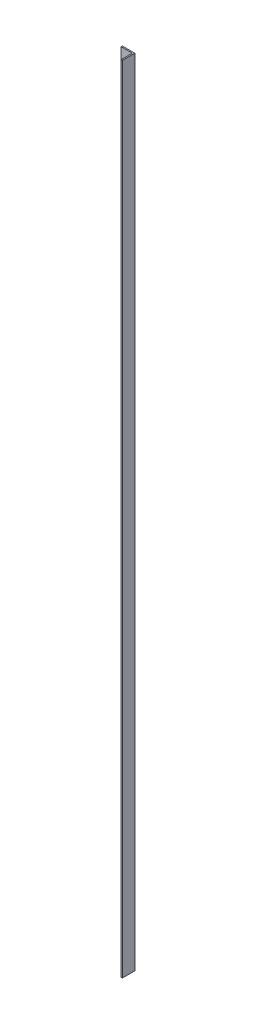
ISO-10303-21;
HEADER;
FILE_DESCRIPTION(('STEP AP214'),'2;1');
FILE_NAME('part.step','',(''),(''),'','','');
FILE_SCHEMA(('AUTOMOTIVE_DESIGN { 1 0 10303 214 1 1 1 1 }'));
ENDSEC;
DATA;
#1=APPLICATION_CONTEXT('core data for automotive mechanical design processes');
#2=APPLICATION_PROTOCOL_DEFINITION('international standard','automotive_design',2000,#1);
#3=PRODUCT_CONTEXT('',#1,'mechanical');
#4=PRODUCT('Part','Part','',(#3));
#5=PRODUCT_RELATED_PRODUCT_CATEGORY('part','',(#4));
#6=PRODUCT_DEFINITION_FORMATION('','',#4);
#7=PRODUCT_DEFINITION_CONTEXT('part definition',#1,'design');
#8=PRODUCT_DEFINITION('design','',#6,#7);
#9=PRODUCT_DEFINITION_SHAPE('','',#8);
#10=(LENGTH_UNIT() NAMED_UNIT(*) SI_UNIT(.MILLI.,.METRE.));
#11=(NAMED_UNIT(*) PLANE_ANGLE_UNIT() SI_UNIT($,.RADIAN.));
#12=(NAMED_UNIT(*) SI_UNIT($,.STERADIAN.) SOLID_ANGLE_UNIT());
#13=UNCERTAINTY_MEASURE_WITH_UNIT(LENGTH_MEASURE(1.E-05),#10,'distance_accuracy_value','');
#14=(GEOMETRIC_REPRESENTATION_CONTEXT(3) GLOBAL_UNCERTAINTY_ASSIGNED_CONTEXT((#13)) GLOBAL_UNIT_ASSIGNED_CONTEXT((#10,
#11,#12)) REPRESENTATION_CONTEXT('',''));
#15=CARTESIAN_POINT('',(0.,0.,0.));
#16=DIRECTION('',(0.,0.,1.));
#17=DIRECTION('',(1.,0.,0.));
#18=AXIS2_PLACEMENT_3D('',#15,#16,#17);
#19=CARTESIAN_POINT('',(-492.499999999999,2893.75,5.));
#20=DIRECTION('',(1.,0.,0.));
#21=DIRECTION('',(0.,1.,0.));
#22=AXIS2_PLACEMENT_3D('',#19,#20,#21);
#23=PLANE('',#22);
#24=DIRECTION('',(0.,-1.,0.));
#25=VECTOR('',#24,1.);
#26=CARTESIAN_POINT('',(-492.499999999999,2893.75,0.));
#27=LINE('',#26,#25);
#28=CARTESIAN_POINT('',(-492.499999999999,2893.75,0.));
#29=VERTEX_POINT('',#28);
#30=CARTESIAN_POINT('',(-492.499999999999,-306.249999999999,0.));
#31=VERTEX_POINT('',#30);
#32=EDGE_CURVE('E94',#29,#31,#27,.T.);
#33=ORIENTED_EDGE('',*,*,#32,.T.);
#34=DIRECTION('',(0.,0.,-1.));
#35=VECTOR('',#34,1.);
#36=CARTESIAN_POINT('',(-492.499999999999,-306.249999999999,5.));
#37=LINE('',#36,#35);
#38=CARTESIAN_POINT('',(-492.499999999999,-306.249999999999,5.));
#39=VERTEX_POINT('',#38);
#40=EDGE_CURVE('E11',#39,#31,#37,.T.);
#41=ORIENTED_EDGE('',*,*,#40,.F.);
#42=DIRECTION('',(0.,-1.,0.));
#43=VECTOR('',#42,1.);
#44=CARTESIAN_POINT('',(-492.499999999999,2893.75,5.));
#45=LINE('',#44,#43);
#46=CARTESIAN_POINT('',(-492.499999999999,2893.75,5.));
#47=VERTEX_POINT('',#46);
#48=EDGE_CURVE('E86',#47,#39,#45,.T.);
#49=ORIENTED_EDGE('',*,*,#48,.F.);
#50=DIRECTION('',(0.,0.,-1.));
#51=VECTOR('',#50,1.);
#52=CARTESIAN_POINT('',(-492.499999999999,2893.75,5.));
#53=LINE('',#52,#51);
#54=EDGE_CURVE('E42',#47,#29,#53,.T.);
#55=ORIENTED_EDGE('',*,*,#54,.T.);
#56=EDGE_LOOP('',(#33,#41,#49,#55));
#57=FACE_BOUND('',#56,.T.);
#58=ADVANCED_FACE('F34',(#57),#23,.F.);
#59=CARTESIAN_POINT('',(-492.499999999999,-306.249999999999,5.));
#60=DIRECTION('',(0.,1.,0.));
#61=DIRECTION('',(0.,0.,1.));
#62=AXIS2_PLACEMENT_3D('',#59,#60,#61);
#63=PLANE('',#62);
#64=DIRECTION('',(1.,0.,0.));
#65=VECTOR('',#64,1.);
#66=CARTESIAN_POINT('',(-492.499999999999,-306.249999999999,0.));
#67=LINE('',#66,#65);
#68=CARTESIAN_POINT('',(-442.499999999999,-306.249999999999,0.));
#69=VERTEX_POINT('',#68);
#70=EDGE_CURVE('E63',#31,#69,#67,.T.);
#71=ORIENTED_EDGE('',*,*,#70,.T.);
#72=DIRECTION('',(0.,0.,-1.));
#73=VECTOR('',#72,1.);
#74=CARTESIAN_POINT('',(-442.499999999999,-306.249999999999,5.));
#75=LINE('',#74,#73);
#76=CARTESIAN_POINT('',(-442.499999999999,-306.249999999999,50.));
#77=VERTEX_POINT('',#76);
#78=EDGE_CURVE('E109',#77,#69,#75,.T.);
#79=ORIENTED_EDGE('',*,*,#78,.F.);
#80=DIRECTION('',(1.,0.,0.));
#81=VECTOR('',#80,1.);
#82=CARTESIAN_POINT('',(-442.499999999999,-306.249999999999,50.));
#83=LINE('',#82,#81);
#84=CARTESIAN_POINT('',(-447.499999999999,-306.249999999999,50.));
#85=VERTEX_POINT('',#84);
#86=EDGE_CURVE('E123',#85,#77,#83,.T.);
#87=ORIENTED_EDGE('',*,*,#86,.F.);
#88=DIRECTION('',(0.,0.,1.));
#89=VECTOR('',#88,1.);
#90=CARTESIAN_POINT('',(-447.499999999999,-306.249999999999,50.));
#91=LINE('',#90,#89);
#92=CARTESIAN_POINT('',(-447.499999999999,-306.249999999999,5.00000000000001));
#93=VERTEX_POINT('',#92);
#94=EDGE_CURVE('E85',#93,#85,#91,.T.);
#95=ORIENTED_EDGE('',*,*,#94,.F.);
#96=DIRECTION('',(1.,0.,0.));
#97=VECTOR('',#96,1.);
#98=CARTESIAN_POINT('',(-492.499999999999,-306.249999999999,5.));
#99=LINE('',#98,#97);
#100=EDGE_CURVE('E80',#39,#93,#99,.T.);
#101=ORIENTED_EDGE('',*,*,#100,.F.);
#102=ORIENTED_EDGE('',*,*,#40,.T.);
#103=EDGE_LOOP('',(#71,#79,#87,#95,#101,#102));
#104=FACE_BOUND('',#103,.T.);
#105=ADVANCED_FACE('F81',(#104),#63,.F.);
#106=CARTESIAN_POINT('',(-492.499999999999,2893.75,5.));
#107=DIRECTION('',(0.,-1.,0.));
#108=DIRECTION('',(0.,0.,-1.));
#109=AXIS2_PLACEMENT_3D('',#106,#107,#108);
#110=PLANE('',#109);
#111=DIRECTION('',(-1.,0.,0.));
#112=VECTOR('',#111,1.);
#113=CARTESIAN_POINT('',(-492.499999999999,2893.75,0.));
#114=LINE('',#113,#112);
#115=CARTESIAN_POINT('',(-442.499999999999,2893.75,0.));
#116=VERTEX_POINT('',#115);
#117=EDGE_CURVE('E92',#116,#29,#114,.T.);
#118=ORIENTED_EDGE('',*,*,#117,.T.);
#119=ORIENTED_EDGE('',*,*,#54,.F.);
#120=DIRECTION('',(-1.,0.,0.));
#121=VECTOR('',#120,1.);
#122=CARTESIAN_POINT('',(-492.499999999999,2893.75,5.));
#123=LINE('',#122,#121);
#124=CARTESIAN_POINT('',(-447.499999999999,2893.75,5.));
#125=VERTEX_POINT('',#124);
#126=EDGE_CURVE('E50',#125,#47,#123,.T.);
#127=ORIENTED_EDGE('',*,*,#126,.F.);
#128=DIRECTION('',(0.,0.,1.));
#129=VECTOR('',#128,1.);
#130=CARTESIAN_POINT('',(-447.499999999999,2893.75,50.));
#131=LINE('',#130,#129);
#132=CARTESIAN_POINT('',(-447.499999999999,2893.75,50.));
#133=VERTEX_POINT('',#132);
#134=EDGE_CURVE('E118',#125,#133,#131,.T.);
#135=ORIENTED_EDGE('',*,*,#134,.T.);
#136=DIRECTION('',(1.,0.,0.));
#137=VECTOR('',#136,1.);
#138=CARTESIAN_POINT('',(-442.499999999999,2893.75,50.));
#139=LINE('',#138,#137);
#140=CARTESIAN_POINT('',(-442.499999999999,2893.75,50.));
#141=VERTEX_POINT('',#140);
#142=EDGE_CURVE('E115',#133,#141,#139,.T.);
#143=ORIENTED_EDGE('',*,*,#142,.T.);
#144=DIRECTION('',(0.,0.,-1.));
#145=VECTOR('',#144,1.);
#146=CARTESIAN_POINT('',(-442.499999999999,2893.75,0.));
#147=LINE('',#146,#145);
#148=EDGE_CURVE('E112',#141,#116,#147,.T.);
#149=ORIENTED_EDGE('',*,*,#148,.T.);
#150=EDGE_LOOP('',(#118,#119,#127,#135,#143,#149));
#151=FACE_BOUND('',#150,.T.);
#152=ADVANCED_FACE('F143',(#151),#110,.F.);
#153=CARTESIAN_POINT('',(0.,0.,5.));
#154=DIRECTION('',(0.,0.,1.));
#155=DIRECTION('',(1.,0.,0.));
#156=AXIS2_PLACEMENT_3D('',#153,#154,#155);
#157=PLANE('',#156);
#158=ORIENTED_EDGE('',*,*,#48,.T.);
#159=ORIENTED_EDGE('',*,*,#100,.T.);
#160=DIRECTION('',(0.,1.,0.));
#161=VECTOR('',#160,1.);
#162=CARTESIAN_POINT('',(-447.499999999999,2893.75,5.));
#163=LINE('',#162,#161);
#164=EDGE_CURVE('E70',#93,#125,#163,.T.);
#165=ORIENTED_EDGE('',*,*,#164,.T.);
#166=ORIENTED_EDGE('',*,*,#126,.T.);
#167=EDGE_LOOP('',(#158,#159,#165,#166));
#168=FACE_BOUND('',#167,.T.);
#169=ADVANCED_FACE('F89',(#168),#157,.T.);
#170=CARTESIAN_POINT('',(0.,0.,0.));
#171=DIRECTION('',(0.,0.,1.));
#172=DIRECTION('',(1.,0.,0.));
#173=AXIS2_PLACEMENT_3D('',#170,#171,#172);
#174=PLANE('',#173);
#175=ORIENTED_EDGE('',*,*,#32,.F.);
#176=ORIENTED_EDGE('',*,*,#117,.F.);
#177=DIRECTION('',(0.,1.,0.));
#178=VECTOR('',#177,1.);
#179=CARTESIAN_POINT('',(-442.499999999999,-306.249999999999,0.));
#180=LINE('',#179,#178);
#181=EDGE_CURVE('E96',#69,#116,#180,.T.);
#182=ORIENTED_EDGE('',*,*,#181,.F.);
#183=ORIENTED_EDGE('',*,*,#70,.F.);
#184=EDGE_LOOP('',(#175,#176,#182,#183));
#185=FACE_BOUND('',#184,.T.);
#186=ADVANCED_FACE('F140',(#185),#174,.F.);
#187=CARTESIAN_POINT('',(-447.499999999999,-306.249999999999,50.));
#188=DIRECTION('',(-1.,0.,0.));
#189=DIRECTION('',(0.,0.,1.));
#190=AXIS2_PLACEMENT_3D('',#187,#188,#189);
#191=PLANE('',#190);
#192=ORIENTED_EDGE('',*,*,#164,.F.);
#193=ORIENTED_EDGE('',*,*,#94,.T.);
#194=DIRECTION('',(0.,1.,0.));
#195=VECTOR('',#194,1.);
#196=CARTESIAN_POINT('',(-447.499999999999,-306.249999999999,50.));
#197=LINE('',#196,#195);
#198=EDGE_CURVE('E106',#85,#133,#197,.T.);
#199=ORIENTED_EDGE('',*,*,#198,.T.);
#200=ORIENTED_EDGE('',*,*,#134,.F.);
#201=EDGE_LOOP('',(#192,#193,#199,#200));
#202=FACE_BOUND('',#201,.T.);
#203=ADVANCED_FACE('F128',(#202),#191,.T.);
#204=CARTESIAN_POINT('',(-442.499999999999,-306.249999999999,0.));
#205=DIRECTION('',(1.,0.,0.));
#206=DIRECTION('',(0.,0.,-1.));
#207=AXIS2_PLACEMENT_3D('',#204,#205,#206);
#208=PLANE('',#207);
#209=ORIENTED_EDGE('',*,*,#148,.F.);
#210=DIRECTION('',(0.,1.,0.));
#211=VECTOR('',#210,1.);
#212=CARTESIAN_POINT('',(-442.499999999999,-306.249999999999,50.));
#213=LINE('',#212,#211);
#214=EDGE_CURVE('E100',#77,#141,#213,.T.);
#215=ORIENTED_EDGE('',*,*,#214,.F.);
#216=ORIENTED_EDGE('',*,*,#78,.T.);
#217=ORIENTED_EDGE('',*,*,#181,.T.);
#218=EDGE_LOOP('',(#209,#215,#216,#217));
#219=FACE_BOUND('',#218,.T.);
#220=ADVANCED_FACE('F139',(#219),#208,.T.);
#221=CARTESIAN_POINT('',(-442.499999999999,-306.249999999999,50.));
#222=DIRECTION('',(0.,0.,1.));
#223=DIRECTION('',(1.,0.,0.));
#224=AXIS2_PLACEMENT_3D('',#221,#222,#223);
#225=PLANE('',#224);
#226=ORIENTED_EDGE('',*,*,#142,.F.);
#227=ORIENTED_EDGE('',*,*,#198,.F.);
#228=ORIENTED_EDGE('',*,*,#86,.T.);
#229=ORIENTED_EDGE('',*,*,#214,.T.);
#230=EDGE_LOOP('',(#226,#227,#228,#229));
#231=FACE_BOUND('',#230,.T.);
#232=ADVANCED_FACE('F133',(#231),#225,.T.);
#233=CLOSED_SHELL('',(#58,#105,#152,#169,#186,#203,#220,#232));
#234=MANIFOLD_SOLID_BREP('B2',#233);
#235=ADVANCED_BREP_SHAPE_REPRESENTATION('',(#18,#234),#14);
#236=SHAPE_DEFINITION_REPRESENTATION(#9,#235);
ENDSEC;
END-ISO-10303-21;
